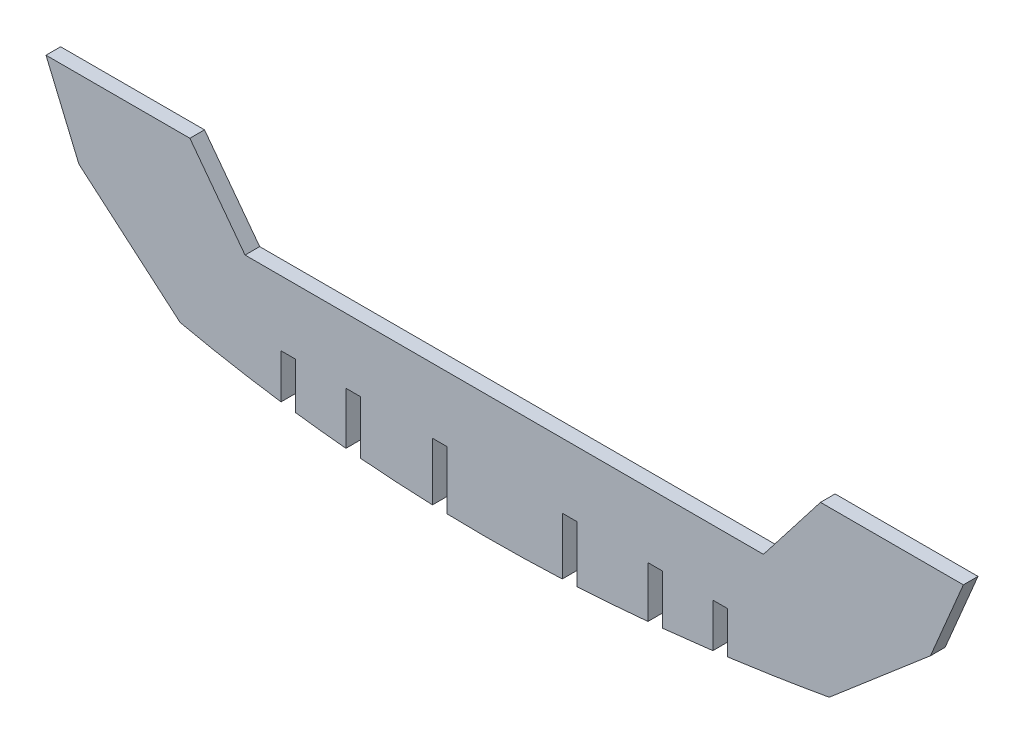
ISO-10303-21;
HEADER;
FILE_DESCRIPTION(('STEP AP214'),'2;1');
FILE_NAME('part.step','',(''),(''),'','','');
FILE_SCHEMA(('AUTOMOTIVE_DESIGN { 1 0 10303 214 1 1 1 1 }'));
ENDSEC;
DATA;
#1=APPLICATION_CONTEXT('core data for automotive mechanical design processes');
#2=APPLICATION_PROTOCOL_DEFINITION('international standard','automotive_design',2000,#1);
#3=PRODUCT_CONTEXT('',#1,'mechanical');
#4=PRODUCT('Part','Part','',(#3));
#5=PRODUCT_RELATED_PRODUCT_CATEGORY('part','',(#4));
#6=PRODUCT_DEFINITION_FORMATION('','',#4);
#7=PRODUCT_DEFINITION_CONTEXT('part definition',#1,'design');
#8=PRODUCT_DEFINITION('design','',#6,#7);
#9=PRODUCT_DEFINITION_SHAPE('','',#8);
#10=(LENGTH_UNIT() NAMED_UNIT(*) SI_UNIT(.MILLI.,.METRE.));
#11=(NAMED_UNIT(*) PLANE_ANGLE_UNIT() SI_UNIT($,.RADIAN.));
#12=(NAMED_UNIT(*) SI_UNIT($,.STERADIAN.) SOLID_ANGLE_UNIT());
#13=UNCERTAINTY_MEASURE_WITH_UNIT(LENGTH_MEASURE(1.E-05),#10,'distance_accuracy_value','');
#14=(GEOMETRIC_REPRESENTATION_CONTEXT(3) GLOBAL_UNCERTAINTY_ASSIGNED_CONTEXT((#13)) GLOBAL_UNIT_ASSIGNED_CONTEXT((#10,
#11,#12)) REPRESENTATION_CONTEXT('',''));
#15=CARTESIAN_POINT('',(0.,0.,0.));
#16=DIRECTION('',(0.,0.,1.));
#17=DIRECTION('',(1.,0.,0.));
#18=AXIS2_PLACEMENT_3D('',#15,#16,#17);
#19=CARTESIAN_POINT('',(-95.25,-19.05,4.2926));
#20=CARTESIAN_POINT('',(-66.0792350111344,-25.5146809383429,4.2926));
#21=CARTESIAN_POINT('',(-2.12159073980995,-32.083739423019,4.2926));
#22=CARTESIAN_POINT('',(61.7618618980102,-25.0102467709334,4.2926));
#23=CARTESIAN_POINT('',(95.25,-19.05,4.2926));
#24=B_SPLINE_CURVE_WITH_KNOTS('',3,(#19,#20,#21,#22,#23),.UNSPECIFIED.,.F.,.F.,(4,1,4),(0.,
0.46719867774018,1.),.UNSPECIFIED.);
#25=DIRECTION('',(0.,0.,-1.));
#26=VECTOR('',#25,1.);
#27=SURFACE_OF_LINEAR_EXTRUSION('',#24,#26);
#28=CARTESIAN_POINT('',(-42.3037,-27.0947511234712,4.2926));
#29=VERTEX_POINT('',#28);
#30=CARTESIAN_POINT('',(-21.1963,-28.3817433657437,4.2926));
#31=VERTEX_POINT('',#30);
#32=EDGE_CURVE('E934',#29,#31,#24,.T.);
#33=ORIENTED_EDGE('',*,*,#32,.F.);
#34=DIRECTION('',(0.,0.,-1.));
#35=VECTOR('',#34,1.);
#36=CARTESIAN_POINT('',(-42.3037,-27.0947511234712,4.2926));
#37=LINE('',#36,#35);
#38=CARTESIAN_POINT('',(-42.3037,-27.0947511234712,0.));
#39=VERTEX_POINT('',#38);
#40=EDGE_CURVE('E346',#29,#39,#37,.T.);
#41=ORIENTED_EDGE('',*,*,#40,.T.);
#42=CARTESIAN_POINT('',(-95.25,-19.05,0.));
#43=CARTESIAN_POINT('',(-66.0792350111344,-25.5146809383429,0.));
#44=CARTESIAN_POINT('',(-2.12159073980995,-32.083739423019,0.));
#45=CARTESIAN_POINT('',(61.7618618980102,-25.0102467709334,0.));
#46=CARTESIAN_POINT('',(95.25,-19.05,0.));
#47=B_SPLINE_CURVE_WITH_KNOTS('',3,(#42,#43,#44,#45,#46),.UNSPECIFIED.,.F.,.F.,(4,1,4),(0.,
0.46719867774018,1.),.UNSPECIFIED.);
#48=CARTESIAN_POINT('',(-21.1963,-28.3817433657437,0.));
#49=VERTEX_POINT('',#48);
#50=EDGE_CURVE('E428',#39,#49,#47,.T.);
#51=ORIENTED_EDGE('',*,*,#50,.T.);
#52=DIRECTION('',(0.,0.,-1.));
#53=VECTOR('',#52,1.);
#54=CARTESIAN_POINT('',(-21.1963,-28.3817433657437,4.2926));
#55=LINE('',#54,#53);
#56=EDGE_CURVE('E343',#49,#31,#55,.F.);
#57=ORIENTED_EDGE('',*,*,#56,.T.);
#58=EDGE_LOOP('',(#33,#41,#51,#57));
#59=FACE_BOUND('',#58,.T.);
#60=ADVANCED_FACE('F36',(#59),#27,.F.);
#61=CARTESIAN_POINT('',(-16.9037,-28.5176362998393,4.2926));
#62=VERTEX_POINT('',#61);
#63=CARTESIAN_POINT('',(16.9037,-28.1643569932418,4.2926));
#64=VERTEX_POINT('',#63);
#65=EDGE_CURVE('E341',#62,#64,#24,.T.);
#66=ORIENTED_EDGE('',*,*,#65,.F.);
#67=DIRECTION('',(0.,0.,-1.));
#68=VECTOR('',#67,1.);
#69=CARTESIAN_POINT('',(-16.9037,-28.5176362998393,4.2926));
#70=LINE('',#69,#68);
#71=CARTESIAN_POINT('',(-16.9037,-28.5176362998393,0.));
#72=VERTEX_POINT('',#71);
#73=EDGE_CURVE('E332',#62,#72,#70,.T.);
#74=ORIENTED_EDGE('',*,*,#73,.T.);
#75=CARTESIAN_POINT('',(16.9037,-28.1643569932418,0.));
#76=VERTEX_POINT('',#75);
#77=EDGE_CURVE('E328',#72,#76,#47,.T.);
#78=ORIENTED_EDGE('',*,*,#77,.T.);
#79=DIRECTION('',(0.,0.,-1.));
#80=VECTOR('',#79,1.);
#81=CARTESIAN_POINT('',(16.9037,-28.1643569932418,4.2926));
#82=LINE('',#81,#80);
#83=EDGE_CURVE('E527',#76,#64,#82,.F.);
#84=ORIENTED_EDGE('',*,*,#83,.T.);
#85=EDGE_LOOP('',(#66,#74,#78,#84));
#86=FACE_BOUND('',#85,.T.);
#87=ADVANCED_FACE('F338',(#86),#27,.F.);
#88=CARTESIAN_POINT('',(46.3388099629851,-25.969523057212,4.2926));
#89=VERTEX_POINT('',#88);
#90=CARTESIAN_POINT('',(61.0962099629851,-24.2813571350564,4.2926));
#91=VERTEX_POINT('',#90);
#92=EDGE_CURVE('E538',#89,#91,#24,.T.);
#93=ORIENTED_EDGE('',*,*,#92,.F.);
#94=DIRECTION('',(0.,0.,-1.));
#95=VECTOR('',#94,1.);
#96=CARTESIAN_POINT('',(46.3388099629852,-25.969523057212,4.2926));
#97=LINE('',#96,#95);
#98=CARTESIAN_POINT('',(46.3388099629851,-25.969523057212,0.));
#99=VERTEX_POINT('',#98);
#100=EDGE_CURVE('E349',#89,#99,#97,.T.);
#101=ORIENTED_EDGE('',*,*,#100,.T.);
#102=CARTESIAN_POINT('',(61.0962099629851,-24.2813571350564,0.));
#103=VERTEX_POINT('',#102);
#104=EDGE_CURVE('E416',#99,#103,#47,.T.);
#105=ORIENTED_EDGE('',*,*,#104,.T.);
#106=DIRECTION('',(0.,0.,-1.));
#107=VECTOR('',#106,1.);
#108=CARTESIAN_POINT('',(61.0962099629851,-24.2813571350564,4.2926));
#109=LINE('',#108,#107);
#110=EDGE_CURVE('E531',#103,#91,#109,.F.);
#111=ORIENTED_EDGE('',*,*,#110,.T.);
#112=EDGE_LOOP('',(#93,#101,#105,#111));
#113=FACE_BOUND('',#112,.T.);
#114=ADVANCED_FACE('F536',(#113),#27,.F.);
#115=CARTESIAN_POINT('',(65.3888099629851,-23.7221459042318,4.2926));
#116=VERTEX_POINT('',#115);
#117=CARTESIAN_POINT('',(95.25,-19.05,4.2926));
#118=VERTEX_POINT('',#117);
#119=EDGE_CURVE('E294',#116,#118,#24,.T.);
#120=ORIENTED_EDGE('',*,*,#119,.F.);
#121=DIRECTION('',(0.,0.,-1.));
#122=VECTOR('',#121,1.);
#123=CARTESIAN_POINT('',(65.3888099629851,-23.7221459042318,4.2926));
#124=LINE('',#123,#122);
#125=CARTESIAN_POINT('',(65.3888099629851,-23.7221459042318,0.));
#126=VERTEX_POINT('',#125);
#127=EDGE_CURVE('E415',#116,#126,#124,.T.);
#128=ORIENTED_EDGE('',*,*,#127,.T.);
#129=CARTESIAN_POINT('',(95.25,-19.05,0.));
#130=VERTEX_POINT('',#129);
#131=EDGE_CURVE('E362',#126,#130,#47,.T.);
#132=ORIENTED_EDGE('',*,*,#131,.T.);
#133=DIRECTION('',(0.,0.,-1.));
#134=VECTOR('',#133,1.);
#135=CARTESIAN_POINT('',(95.25,-19.05,4.2926));
#136=LINE('',#135,#134);
#137=EDGE_CURVE('E307',#118,#130,#136,.T.);
#138=ORIENTED_EDGE('',*,*,#137,.F.);
#139=EDGE_LOOP('',(#120,#128,#132,#138));
#140=FACE_BOUND('',#139,.T.);
#141=ADVANCED_FACE('F413',(#140),#27,.F.);
#142=CARTESIAN_POINT('',(21.1963,-27.9476728082947,0.));
#143=VERTEX_POINT('',#142);
#144=CARTESIAN_POINT('',(42.0462099629851,-26.3897699887696,0.));
#145=VERTEX_POINT('',#144);
#146=EDGE_CURVE('E418',#143,#145,#47,.T.);
#147=ORIENTED_EDGE('',*,*,#146,.T.);
#148=DIRECTION('',(0.,0.,-1.));
#149=VECTOR('',#148,1.);
#150=CARTESIAN_POINT('',(42.0462099629851,-26.3897699887696,4.2926));
#151=LINE('',#150,#149);
#152=CARTESIAN_POINT('',(42.0462099629851,-26.3897699887696,4.2926));
#153=VERTEX_POINT('',#152);
#154=EDGE_CURVE('E534',#145,#153,#151,.F.);
#155=ORIENTED_EDGE('',*,*,#154,.T.);
#156=CARTESIAN_POINT('',(21.1963,-27.9476728082947,4.2926));
#157=VERTEX_POINT('',#156);
#158=EDGE_CURVE('E554',#157,#153,#24,.T.);
#159=ORIENTED_EDGE('',*,*,#158,.F.);
#160=DIRECTION('',(0.,0.,-1.));
#161=VECTOR('',#160,1.);
#162=CARTESIAN_POINT('',(21.1963,-27.9476728082947,4.2926));
#163=LINE('',#162,#161);
#164=EDGE_CURVE('E529',#157,#143,#163,.T.);
#165=ORIENTED_EDGE('',*,*,#164,.T.);
#166=EDGE_LOOP('',(#147,#155,#159,#165));
#167=FACE_BOUND('',#166,.T.);
#168=ADVANCED_FACE('F584',(#167),#27,.F.);
#169=CARTESIAN_POINT('',(-61.3537,-25.0213087322138,0.));
#170=VERTEX_POINT('',#169);
#171=CARTESIAN_POINT('',(-46.5963,-26.7045433789957,0.));
#172=VERTEX_POINT('',#171);
#173=EDGE_CURVE('E392',#170,#172,#47,.T.);
#174=ORIENTED_EDGE('',*,*,#173,.T.);
#175=DIRECTION('',(0.,0.,-1.));
#176=VECTOR('',#175,1.);
#177=CARTESIAN_POINT('',(-46.5963,-26.7045433789957,4.2926));
#178=LINE('',#177,#176);
#179=CARTESIAN_POINT('',(-46.5963,-26.7045433789957,4.2926));
#180=VERTEX_POINT('',#179);
#181=EDGE_CURVE('E342',#172,#180,#178,.F.);
#182=ORIENTED_EDGE('',*,*,#181,.T.);
#183=CARTESIAN_POINT('',(-61.3537,-25.0213087322138,4.2926));
#184=VERTEX_POINT('',#183);
#185=EDGE_CURVE('E370',#184,#180,#24,.T.);
#186=ORIENTED_EDGE('',*,*,#185,.F.);
#187=DIRECTION('',(0.,0.,-1.));
#188=VECTOR('',#187,1.);
#189=CARTESIAN_POINT('',(-61.3537,-25.0213087322138,4.2926));
#190=LINE('',#189,#188);
#191=EDGE_CURVE('E438',#184,#170,#190,.T.);
#192=ORIENTED_EDGE('',*,*,#191,.T.);
#193=EDGE_LOOP('',(#174,#182,#186,#192));
#194=FACE_BOUND('',#193,.T.);
#195=ADVANCED_FACE('F435',(#194),#27,.F.);
#196=CARTESIAN_POINT('',(-95.25,-19.05,0.));
#197=VERTEX_POINT('',#196);
#198=CARTESIAN_POINT('',(-65.6463,-24.4302717503621,0.));
#199=VERTEX_POINT('',#198);
#200=EDGE_CURVE('E386',#197,#199,#47,.T.);
#201=ORIENTED_EDGE('',*,*,#200,.T.);
#202=DIRECTION('',(0.,0.,-1.));
#203=VECTOR('',#202,1.);
#204=CARTESIAN_POINT('',(-65.6463,-24.4302717503621,4.2926));
#205=LINE('',#204,#203);
#206=CARTESIAN_POINT('',(-65.6463,-24.4302717503621,4.2926));
#207=VERTEX_POINT('',#206);
#208=EDGE_CURVE('E521',#199,#207,#205,.F.);
#209=ORIENTED_EDGE('',*,*,#208,.T.);
#210=CARTESIAN_POINT('',(-95.25,-19.05,4.2926));
#211=VERTEX_POINT('',#210);
#212=EDGE_CURVE('E363',#211,#207,#24,.T.);
#213=ORIENTED_EDGE('',*,*,#212,.F.);
#214=DIRECTION('',(0.,0.,-1.));
#215=VECTOR('',#214,1.);
#216=CARTESIAN_POINT('',(-95.25,-19.05,4.2926));
#217=LINE('',#216,#215);
#218=EDGE_CURVE('E295',#211,#197,#217,.T.);
#219=ORIENTED_EDGE('',*,*,#218,.T.);
#220=EDGE_LOOP('',(#201,#209,#213,#219));
#221=FACE_BOUND('',#220,.T.);
#222=ADVANCED_FACE('F38',(#221),#27,.F.);
#223=CARTESIAN_POINT('',(49.6173329393389,-58.0522795390266,4.2926));
#224=DIRECTION('',(0.649720599003113,-0.760173100833643,0.));
#225=DIRECTION('',(0.760173100833643,0.649720599003113,0.));
#226=AXIS2_PLACEMENT_3D('',#223,#224,#225);
#227=PLANE('',#226);
#228=DIRECTION('',(-0.760173100833643,-0.649720599003113,0.));
#229=VECTOR('',#228,1.);
#230=CARTESIAN_POINT('',(49.6173329393389,-58.0522795390266,0.));
#231=LINE('',#230,#229);
#232=CARTESIAN_POINT('',(124.968,6.35,0.));
#233=VERTEX_POINT('',#232);
#234=EDGE_CURVE('E391',#233,#130,#231,.T.);
#235=ORIENTED_EDGE('',*,*,#234,.F.);
#236=DIRECTION('',(0.,0.,-1.));
#237=VECTOR('',#236,1.);
#238=CARTESIAN_POINT('',(124.968,6.35,4.2926));
#239=LINE('',#238,#237);
#240=CARTESIAN_POINT('',(124.968,6.35,4.2926));
#241=VERTEX_POINT('',#240);
#242=EDGE_CURVE('E305',#241,#233,#239,.T.);
#243=ORIENTED_EDGE('',*,*,#242,.F.);
#244=DIRECTION('',(-0.760173100833643,-0.649720599003113,0.));
#245=VECTOR('',#244,1.);
#246=CARTESIAN_POINT('',(49.6173329393389,-58.0522795390266,4.2926));
#247=LINE('',#246,#245);
#248=EDGE_CURVE('E369',#241,#118,#247,.T.);
#249=ORIENTED_EDGE('',*,*,#248,.T.);
#250=ORIENTED_EDGE('',*,*,#137,.T.);
#251=EDGE_LOOP('',(#235,#243,#249,#250));
#252=FACE_BOUND('',#251,.T.);
#253=ADVANCED_FACE('F409',(#252),#227,.T.);
#254=CARTESIAN_POINT('',(103.784974853311,-43.8203227158424,4.2926));
#255=DIRECTION('',(0.921249561411386,-0.388972037040363,0.));
#256=DIRECTION('',(0.388972037040363,0.921249561411386,0.));
#257=AXIS2_PLACEMENT_3D('',#254,#255,#256);
#258=PLANE('',#257);
#259=DIRECTION('',(-0.388972037040363,-0.921249561411386,0.));
#260=VECTOR('',#259,1.);
#261=CARTESIAN_POINT('',(103.784974853311,-43.8203227158424,0.));
#262=LINE('',#261,#260);
#263=CARTESIAN_POINT('',(134.62,29.21,0.));
#264=VERTEX_POINT('',#263);
#265=EDGE_CURVE('E289',#264,#233,#262,.T.);
#266=ORIENTED_EDGE('',*,*,#265,.F.);
#267=DIRECTION('',(0.,0.,-1.));
#268=VECTOR('',#267,1.);
#269=CARTESIAN_POINT('',(134.62,29.21,4.2926));
#270=LINE('',#269,#268);
#271=CARTESIAN_POINT('',(134.62,29.21,4.2926));
#272=VERTEX_POINT('',#271);
#273=EDGE_CURVE('E302',#272,#264,#270,.T.);
#274=ORIENTED_EDGE('',*,*,#273,.F.);
#275=DIRECTION('',(-0.388972037040363,-0.921249561411386,0.));
#276=VECTOR('',#275,1.);
#277=CARTESIAN_POINT('',(103.784974853311,-43.8203227158424,4.2926));
#278=LINE('',#277,#276);
#279=EDGE_CURVE('E376',#272,#241,#278,.T.);
#280=ORIENTED_EDGE('',*,*,#279,.T.);
#281=ORIENTED_EDGE('',*,*,#242,.T.);
#282=EDGE_LOOP('',(#266,#274,#280,#281));
#283=FACE_BOUND('',#282,.T.);
#284=ADVANCED_FACE('F405',(#283),#258,.T.);
#285=CARTESIAN_POINT('',(0.,29.21,4.2926));
#286=DIRECTION('',(0.,1.,0.));
#287=DIRECTION('',(0.,0.,1.));
#288=AXIS2_PLACEMENT_3D('',#285,#286,#287);
#289=PLANE('',#288);
#290=DIRECTION('',(0.,0.,1.));
#291=VECTOR('',#290,1.);
#292=CARTESIAN_POINT('',(92.6821762916418,29.21,0.));
#293=LINE('',#292,#291);
#294=CARTESIAN_POINT('',(92.6821762916418,29.21,0.));
#295=VERTEX_POINT('',#294);
#296=CARTESIAN_POINT('',(92.6821762916418,29.21,4.2926));
#297=VERTEX_POINT('',#296);
#298=EDGE_CURVE('E611',#295,#297,#293,.T.);
#299=ORIENTED_EDGE('',*,*,#298,.T.);
#300=DIRECTION('',(1.,0.,0.));
#301=VECTOR('',#300,1.);
#302=CARTESIAN_POINT('',(0.,29.21,4.2926));
#303=LINE('',#302,#301);
#304=EDGE_CURVE('E379',#297,#272,#303,.T.);
#305=ORIENTED_EDGE('',*,*,#304,.T.);
#306=ORIENTED_EDGE('',*,*,#273,.T.);
#307=DIRECTION('',(1.,0.,0.));
#308=VECTOR('',#307,1.);
#309=CARTESIAN_POINT('',(0.,29.21,0.));
#310=LINE('',#309,#308);
#311=EDGE_CURVE('E285',#295,#264,#310,.T.);
#312=ORIENTED_EDGE('',*,*,#311,.F.);
#313=EDGE_LOOP('',(#299,#305,#306,#312));
#314=FACE_BOUND('',#313,.T.);
#315=ADVANCED_FACE('F623',(#314),#289,.T.);
#316=CARTESIAN_POINT('',(0.,29.21,4.2926));
#317=DIRECTION('',(0.,-1.,0.));
#318=DIRECTION('',(1.,0.,0.));
#319=AXIS2_PLACEMENT_3D('',#316,#317,#318);
#320=PLANE('',#319);
#321=DIRECTION('',(-1.,0.,0.));
#322=VECTOR('',#321,1.);
#323=CARTESIAN_POINT('',(0.,29.21,4.2926));
#324=LINE('',#323,#322);
#325=CARTESIAN_POINT('',(-92.3925,29.21,4.2926));
#326=VERTEX_POINT('',#325);
#327=CARTESIAN_POINT('',(-134.62,29.21,4.2926));
#328=VERTEX_POINT('',#327);
#329=EDGE_CURVE('E276',#326,#328,#324,.T.);
#330=ORIENTED_EDGE('',*,*,#329,.F.);
#331=DIRECTION('',(0.,0.,1.));
#332=VECTOR('',#331,1.);
#333=CARTESIAN_POINT('',(-92.3925,29.21,0.));
#334=LINE('',#333,#332);
#335=CARTESIAN_POINT('',(-92.3925,29.21,0.));
#336=VERTEX_POINT('',#335);
#337=EDGE_CURVE('E260',#336,#326,#334,.T.);
#338=ORIENTED_EDGE('',*,*,#337,.F.);
#339=DIRECTION('',(-1.,0.,0.));
#340=VECTOR('',#339,1.);
#341=CARTESIAN_POINT('',(0.,29.21,0.));
#342=LINE('',#341,#340);
#343=CARTESIAN_POINT('',(-134.62,29.21,0.));
#344=VERTEX_POINT('',#343);
#345=EDGE_CURVE('E274',#336,#344,#342,.T.);
#346=ORIENTED_EDGE('',*,*,#345,.T.);
#347=DIRECTION('',(0.,0.,-1.));
#348=VECTOR('',#347,1.);
#349=CARTESIAN_POINT('',(-134.62,29.21,4.2926));
#350=LINE('',#349,#348);
#351=EDGE_CURVE('E300',#328,#344,#350,.T.);
#352=ORIENTED_EDGE('',*,*,#351,.F.);
#353=EDGE_LOOP('',(#330,#338,#346,#352));
#354=FACE_BOUND('',#353,.T.);
#355=ADVANCED_FACE('F272',(#354),#320,.F.);
#356=CARTESIAN_POINT('',(-103.784974853311,-43.8203227158424,4.2926));
#357=DIRECTION('',(0.921249561411386,0.388972037040363,0.));
#358=DIRECTION('',(-0.388972037040363,0.921249561411386,0.));
#359=AXIS2_PLACEMENT_3D('',#356,#357,#358);
#360=PLANE('',#359);
#361=DIRECTION('',(0.388972037040363,-0.921249561411386,0.));
#362=VECTOR('',#361,1.);
#363=CARTESIAN_POINT('',(-103.784974853311,-43.8203227158424,0.));
#364=LINE('',#363,#362);
#365=CARTESIAN_POINT('',(-124.968,6.35,0.));
#366=VERTEX_POINT('',#365);
#367=EDGE_CURVE('E284',#344,#366,#364,.T.);
#368=ORIENTED_EDGE('',*,*,#367,.T.);
#369=DIRECTION('',(0.,0.,-1.));
#370=VECTOR('',#369,1.);
#371=CARTESIAN_POINT('',(-124.968,6.35,4.2926));
#372=LINE('',#371,#370);
#373=CARTESIAN_POINT('',(-124.968,6.35,4.2926));
#374=VERTEX_POINT('',#373);
#375=EDGE_CURVE('E297',#374,#366,#372,.T.);
#376=ORIENTED_EDGE('',*,*,#375,.F.);
#377=DIRECTION('',(0.388972037040363,-0.921249561411386,0.));
#378=VECTOR('',#377,1.);
#379=CARTESIAN_POINT('',(-103.784974853311,-43.8203227158424,4.2926));
#380=LINE('',#379,#378);
#381=EDGE_CURVE('E382',#328,#374,#380,.T.);
#382=ORIENTED_EDGE('',*,*,#381,.F.);
#383=ORIENTED_EDGE('',*,*,#351,.T.);
#384=EDGE_LOOP('',(#368,#376,#382,#383));
#385=FACE_BOUND('',#384,.T.);
#386=ADVANCED_FACE('F594',(#385),#360,.F.);
#387=CARTESIAN_POINT('',(-49.6173329393389,-58.0522795390266,4.2926));
#388=DIRECTION('',(-0.649720599003113,-0.760173100833643,0.));
#389=DIRECTION('',(0.760173100833643,-0.649720599003113,0.));
#390=AXIS2_PLACEMENT_3D('',#387,#388,#389);
#391=PLANE('',#390);
#392=DIRECTION('',(-0.760173100833643,0.649720599003113,0.));
#393=VECTOR('',#392,1.);
#394=CARTESIAN_POINT('',(-49.6173329393389,-58.0522795390266,0.));
#395=LINE('',#394,#393);
#396=EDGE_CURVE('E287',#197,#366,#395,.T.);
#397=ORIENTED_EDGE('',*,*,#396,.F.);
#398=ORIENTED_EDGE('',*,*,#218,.F.);
#399=DIRECTION('',(-0.760173100833643,0.649720599003113,0.));
#400=VECTOR('',#399,1.);
#401=CARTESIAN_POINT('',(-49.6173329393389,-58.0522795390266,4.2926));
#402=LINE('',#401,#400);
#403=EDGE_CURVE('E298',#211,#374,#402,.T.);
#404=ORIENTED_EDGE('',*,*,#403,.T.);
#405=ORIENTED_EDGE('',*,*,#375,.T.);
#406=EDGE_LOOP('',(#397,#398,#404,#405));
#407=FACE_BOUND('',#406,.T.);
#408=ADVANCED_FACE('F589',(#407),#391,.T.);
#409=CARTESIAN_POINT('',(0.,0.,4.2926));
#410=DIRECTION('',(0.,0.,1.));
#411=DIRECTION('',(1.,0.,0.));
#412=AXIS2_PLACEMENT_3D('',#409,#410,#411);
#413=PLANE('',#412);
#414=DIRECTION('',(0.,1.,0.));
#415=VECTOR('',#414,1.);
#416=CARTESIAN_POINT('',(-42.3037,-31.75,4.2926));
#417=LINE('',#416,#415);
#418=CARTESIAN_POINT('',(-42.3037,-11.43,4.2926));
#419=VERTEX_POINT('',#418);
#420=EDGE_CURVE('E452',#29,#419,#417,.T.);
#421=ORIENTED_EDGE('',*,*,#420,.F.);
#422=ORIENTED_EDGE('',*,*,#32,.T.);
#423=DIRECTION('',(0.,-1.,0.));
#424=VECTOR('',#423,1.);
#425=CARTESIAN_POINT('',(-21.1963,-11.43,4.2926));
#426=LINE('',#425,#424);
#427=CARTESIAN_POINT('',(-21.1963,-11.43,4.2926));
#428=VERTEX_POINT('',#427);
#429=EDGE_CURVE('E462',#428,#31,#426,.T.);
#430=ORIENTED_EDGE('',*,*,#429,.F.);
#431=DIRECTION('',(-1.,0.,0.));
#432=VECTOR('',#431,1.);
#433=CARTESIAN_POINT('',(-21.1963,-11.43,4.2926));
#434=LINE('',#433,#432);
#435=CARTESIAN_POINT('',(-16.9037,-11.43,4.2926));
#436=VERTEX_POINT('',#435);
#437=EDGE_CURVE('E466',#436,#428,#434,.T.);
#438=ORIENTED_EDGE('',*,*,#437,.F.);
#439=DIRECTION('',(0.,1.,0.));
#440=VECTOR('',#439,1.);
#441=CARTESIAN_POINT('',(-16.9037,-11.43,4.2926));
#442=LINE('',#441,#440);
#443=EDGE_CURVE('E464',#62,#436,#442,.T.);
#444=ORIENTED_EDGE('',*,*,#443,.F.);
#445=ORIENTED_EDGE('',*,*,#65,.T.);
#446=DIRECTION('',(0.,-1.,0.));
#447=VECTOR('',#446,1.);
#448=CARTESIAN_POINT('',(16.9037,-11.43,4.2926));
#449=LINE('',#448,#447);
#450=CARTESIAN_POINT('',(16.9037,-11.43,4.2926));
#451=VERTEX_POINT('',#450);
#452=EDGE_CURVE('E606',#451,#64,#449,.T.);
#453=ORIENTED_EDGE('',*,*,#452,.F.);
#454=DIRECTION('',(-1.,0.,0.));
#455=VECTOR('',#454,1.);
#456=CARTESIAN_POINT('',(16.9037,-11.43,4.2926));
#457=LINE('',#456,#455);
#458=CARTESIAN_POINT('',(21.1963,-11.43,4.2926));
#459=VERTEX_POINT('',#458);
#460=EDGE_CURVE('E610',#459,#451,#457,.T.);
#461=ORIENTED_EDGE('',*,*,#460,.F.);
#462=DIRECTION('',(0.,1.,0.));
#463=VECTOR('',#462,1.);
#464=CARTESIAN_POINT('',(21.1963,-11.43,4.2926));
#465=LINE('',#464,#463);
#466=EDGE_CURVE('E608',#157,#459,#465,.T.);
#467=ORIENTED_EDGE('',*,*,#466,.F.);
#468=ORIENTED_EDGE('',*,*,#158,.T.);
#469=DIRECTION('',(0.,-1.,0.));
#470=VECTOR('',#469,1.);
#471=CARTESIAN_POINT('',(42.0462099629851,-11.43,4.2926));
#472=LINE('',#471,#470);
#473=CARTESIAN_POINT('',(42.0462099629851,-11.43,4.2926));
#474=VERTEX_POINT('',#473);
#475=EDGE_CURVE('E477',#474,#153,#472,.T.);
#476=ORIENTED_EDGE('',*,*,#475,.F.);
#477=DIRECTION('',(-1.,0.,0.));
#478=VECTOR('',#477,1.);
#479=CARTESIAN_POINT('',(42.0462099629851,-11.43,4.2926));
#480=LINE('',#479,#478);
#481=CARTESIAN_POINT('',(46.3388099629851,-11.43,4.2926));
#482=VERTEX_POINT('',#481);
#483=EDGE_CURVE('E483',#482,#474,#480,.T.);
#484=ORIENTED_EDGE('',*,*,#483,.F.);
#485=DIRECTION('',(0.,1.,0.));
#486=VECTOR('',#485,1.);
#487=CARTESIAN_POINT('',(46.3388099629851,-11.43,4.2926));
#488=LINE('',#487,#486);
#489=EDGE_CURVE('E481',#89,#482,#488,.T.);
#490=ORIENTED_EDGE('',*,*,#489,.F.);
#491=ORIENTED_EDGE('',*,*,#92,.T.);
#492=DIRECTION('',(0.,-1.,0.));
#493=VECTOR('',#492,1.);
#494=CARTESIAN_POINT('',(61.0962099629851,-11.43,4.2926));
#495=LINE('',#494,#493);
#496=CARTESIAN_POINT('',(61.0962099629851,-11.43,4.2926));
#497=VERTEX_POINT('',#496);
#498=EDGE_CURVE('E495',#497,#91,#495,.T.);
#499=ORIENTED_EDGE('',*,*,#498,.F.);
#500=DIRECTION('',(-1.,0.,0.));
#501=VECTOR('',#500,1.);
#502=CARTESIAN_POINT('',(61.0962099629851,-11.43,4.2926));
#503=LINE('',#502,#501);
#504=CARTESIAN_POINT('',(65.3888099629851,-11.43,4.2926));
#505=VERTEX_POINT('',#504);
#506=EDGE_CURVE('E500',#505,#497,#503,.T.);
#507=ORIENTED_EDGE('',*,*,#506,.F.);
#508=DIRECTION('',(0.,1.,0.));
#509=VECTOR('',#508,1.);
#510=CARTESIAN_POINT('',(65.3888099629851,-11.43,4.2926));
#511=LINE('',#510,#509);
#512=EDGE_CURVE('E277',#116,#505,#511,.T.);
#513=ORIENTED_EDGE('',*,*,#512,.F.);
#514=ORIENTED_EDGE('',*,*,#119,.T.);
#515=ORIENTED_EDGE('',*,*,#248,.F.);
#516=ORIENTED_EDGE('',*,*,#279,.F.);
#517=ORIENTED_EDGE('',*,*,#304,.F.);
#518=DIRECTION('',(0.612741252836286,0.790283592815021,0.));
#519=VECTOR('',#518,1.);
#520=CARTESIAN_POINT('',(75.9425099629851,7.62000000000001,4.2926));
#521=LINE('',#520,#519);
#522=CARTESIAN_POINT('',(75.9425099629851,7.62000000000001,4.2926));
#523=VERTEX_POINT('',#522);
#524=EDGE_CURVE('E619',#523,#297,#521,.T.);
#525=ORIENTED_EDGE('',*,*,#524,.F.);
#526=DIRECTION('',(1.,0.,0.));
#527=VECTOR('',#526,1.);
#528=CARTESIAN_POINT('',(-76.2,7.62000000000001,4.2926));
#529=LINE('',#528,#527);
#530=CARTESIAN_POINT('',(-76.2,7.62000000000001,4.2926));
#531=VERTEX_POINT('',#530);
#532=EDGE_CURVE('E355',#531,#523,#529,.T.);
#533=ORIENTED_EDGE('',*,*,#532,.F.);
#534=DIRECTION('',(0.600000000000001,-0.799999999999999,0.));
#535=VECTOR('',#534,1.);
#536=CARTESIAN_POINT('',(-92.3925,29.21,4.2926));
#537=LINE('',#536,#535);
#538=EDGE_CURVE('E268',#326,#531,#537,.T.);
#539=ORIENTED_EDGE('',*,*,#538,.F.);
#540=ORIENTED_EDGE('',*,*,#329,.T.);
#541=ORIENTED_EDGE('',*,*,#381,.T.);
#542=ORIENTED_EDGE('',*,*,#403,.F.);
#543=ORIENTED_EDGE('',*,*,#212,.T.);
#544=DIRECTION('',(0.,-1.,0.));
#545=VECTOR('',#544,1.);
#546=CARTESIAN_POINT('',(-65.6463,-31.75,4.2926));
#547=LINE('',#546,#545);
#548=CARTESIAN_POINT('',(-65.6463,-11.43,4.2926));
#549=VERTEX_POINT('',#548);
#550=EDGE_CURVE('E510',#549,#207,#547,.T.);
#551=ORIENTED_EDGE('',*,*,#550,.F.);
#552=DIRECTION('',(-1.,0.,0.));
#553=VECTOR('',#552,1.);
#554=CARTESIAN_POINT('',(-65.6463,-11.43,4.2926));
#555=LINE('',#554,#553);
#556=CARTESIAN_POINT('',(-61.3537,-11.43,4.2926));
#557=VERTEX_POINT('',#556);
#558=EDGE_CURVE('E515',#557,#549,#555,.T.);
#559=ORIENTED_EDGE('',*,*,#558,.F.);
#560=DIRECTION('',(0.,1.,0.));
#561=VECTOR('',#560,1.);
#562=CARTESIAN_POINT('',(-61.3537,-31.75,4.2926));
#563=LINE('',#562,#561);
#564=EDGE_CURVE('E459',#184,#557,#563,.T.);
#565=ORIENTED_EDGE('',*,*,#564,.F.);
#566=ORIENTED_EDGE('',*,*,#185,.T.);
#567=DIRECTION('',(0.,-1.,0.));
#568=VECTOR('',#567,1.);
#569=CARTESIAN_POINT('',(-46.5963,-31.75,4.2926));
#570=LINE('',#569,#568);
#571=CARTESIAN_POINT('',(-46.5963,-11.43,4.2926));
#572=VERTEX_POINT('',#571);
#573=EDGE_CURVE('E448',#572,#180,#570,.T.);
#574=ORIENTED_EDGE('',*,*,#573,.F.);
#575=DIRECTION('',(-1.,0.,0.));
#576=VECTOR('',#575,1.);
#577=CARTESIAN_POINT('',(-46.5963,-11.43,4.2926));
#578=LINE('',#577,#576);
#579=EDGE_CURVE('E454',#419,#572,#578,.T.);
#580=ORIENTED_EDGE('',*,*,#579,.F.);
#581=EDGE_LOOP('',(#421,#422,#430,#438,#444,#445,#453,#461,#467,#468,#476,#484,#490,#491,#499,
#507,#513,#514,#515,#516,#517,#525,#533,#539,#540,#541,#542,#543,#551,#559,#565,#566,#574,#580));
#582=FACE_BOUND('',#581,.T.);
#583=ADVANCED_FACE('F552',(#582),#413,.T.);
#584=CARTESIAN_POINT('',(0.,0.,0.));
#585=DIRECTION('',(0.,0.,1.));
#586=DIRECTION('',(1.,0.,0.));
#587=AXIS2_PLACEMENT_3D('',#584,#585,#586);
#588=PLANE('',#587);
#589=ORIENTED_EDGE('',*,*,#50,.F.);
#590=DIRECTION('',(0.,1.,0.));
#591=VECTOR('',#590,1.);
#592=CARTESIAN_POINT('',(-42.3037,0.,0.));
#593=LINE('',#592,#591);
#594=CARTESIAN_POINT('',(-42.3037,-11.43,0.));
#595=VERTEX_POINT('',#594);
#596=EDGE_CURVE('E11',#39,#595,#593,.T.);
#597=ORIENTED_EDGE('',*,*,#596,.T.);
#598=DIRECTION('',(-1.,0.,0.));
#599=VECTOR('',#598,1.);
#600=CARTESIAN_POINT('',(-46.5963,-11.43,0.));
#601=LINE('',#600,#599);
#602=CARTESIAN_POINT('',(-46.5963,-11.43,0.));
#603=VERTEX_POINT('',#602);
#604=EDGE_CURVE('E442',#595,#603,#601,.T.);
#605=ORIENTED_EDGE('',*,*,#604,.T.);
#606=DIRECTION('',(0.,-1.,0.));
#607=VECTOR('',#606,1.);
#608=CARTESIAN_POINT('',(-46.5963,-31.75,0.));
#609=LINE('',#608,#607);
#610=EDGE_CURVE('E52',#603,#172,#609,.T.);
#611=ORIENTED_EDGE('',*,*,#610,.T.);
#612=ORIENTED_EDGE('',*,*,#173,.F.);
#613=DIRECTION('',(0.,1.,0.));
#614=VECTOR('',#613,1.);
#615=CARTESIAN_POINT('',(-61.3537,0.,0.));
#616=LINE('',#615,#614);
#617=CARTESIAN_POINT('',(-61.3537,-11.43,0.));
#618=VERTEX_POINT('',#617);
#619=EDGE_CURVE('E310',#170,#618,#616,.T.);
#620=ORIENTED_EDGE('',*,*,#619,.T.);
#621=DIRECTION('',(-1.,0.,0.));
#622=VECTOR('',#621,1.);
#623=CARTESIAN_POINT('',(-65.6463,-11.43,0.));
#624=LINE('',#623,#622);
#625=CARTESIAN_POINT('',(-65.6463,-11.43,0.));
#626=VERTEX_POINT('',#625);
#627=EDGE_CURVE('E507',#618,#626,#624,.T.);
#628=ORIENTED_EDGE('',*,*,#627,.T.);
#629=DIRECTION('',(0.,-1.,0.));
#630=VECTOR('',#629,1.);
#631=CARTESIAN_POINT('',(-65.6463,-31.75,0.));
#632=LINE('',#631,#630);
#633=EDGE_CURVE('E509',#626,#199,#632,.T.);
#634=ORIENTED_EDGE('',*,*,#633,.T.);
#635=ORIENTED_EDGE('',*,*,#200,.F.);
#636=ORIENTED_EDGE('',*,*,#396,.T.);
#637=ORIENTED_EDGE('',*,*,#367,.F.);
#638=ORIENTED_EDGE('',*,*,#345,.F.);
#639=DIRECTION('',(0.600000000000001,-0.799999999999999,0.));
#640=VECTOR('',#639,1.);
#641=CARTESIAN_POINT('',(-92.3925,29.21,0.));
#642=LINE('',#641,#640);
#643=CARTESIAN_POINT('',(-76.2,7.62000000000001,0.));
#644=VERTEX_POINT('',#643);
#645=EDGE_CURVE('E257',#336,#644,#642,.T.);
#646=ORIENTED_EDGE('',*,*,#645,.T.);
#647=DIRECTION('',(1.,0.,0.));
#648=VECTOR('',#647,1.);
#649=CARTESIAN_POINT('',(-76.2,7.62000000000001,0.));
#650=LINE('',#649,#648);
#651=CARTESIAN_POINT('',(75.9425099629851,7.62000000000001,0.));
#652=VERTEX_POINT('',#651);
#653=EDGE_CURVE('E356',#644,#652,#650,.T.);
#654=ORIENTED_EDGE('',*,*,#653,.T.);
#655=DIRECTION('',(0.612741252836286,0.790283592815021,0.));
#656=VECTOR('',#655,1.);
#657=CARTESIAN_POINT('',(75.9425099629851,7.62000000000001,0.));
#658=LINE('',#657,#656);
#659=EDGE_CURVE('E617',#652,#295,#658,.T.);
#660=ORIENTED_EDGE('',*,*,#659,.T.);
#661=ORIENTED_EDGE('',*,*,#311,.T.);
#662=ORIENTED_EDGE('',*,*,#265,.T.);
#663=ORIENTED_EDGE('',*,*,#234,.T.);
#664=ORIENTED_EDGE('',*,*,#131,.F.);
#665=DIRECTION('',(0.,1.,0.));
#666=VECTOR('',#665,1.);
#667=CARTESIAN_POINT('',(65.3888099629851,0.,0.));
#668=LINE('',#667,#666);
#669=CARTESIAN_POINT('',(65.3888099629851,-11.43,0.));
#670=VERTEX_POINT('',#669);
#671=EDGE_CURVE('E316',#126,#670,#668,.T.);
#672=ORIENTED_EDGE('',*,*,#671,.T.);
#673=DIRECTION('',(-1.,0.,0.));
#674=VECTOR('',#673,1.);
#675=CARTESIAN_POINT('',(61.0962099629851,-11.43,0.));
#676=LINE('',#675,#674);
#677=CARTESIAN_POINT('',(61.0962099629851,-11.43,0.));
#678=VERTEX_POINT('',#677);
#679=EDGE_CURVE('E491',#670,#678,#676,.T.);
#680=ORIENTED_EDGE('',*,*,#679,.T.);
#681=DIRECTION('',(0.,-1.,0.));
#682=VECTOR('',#681,1.);
#683=CARTESIAN_POINT('',(61.0962099629851,-11.43,0.));
#684=LINE('',#683,#682);
#685=EDGE_CURVE('E494',#678,#103,#684,.T.);
#686=ORIENTED_EDGE('',*,*,#685,.T.);
#687=ORIENTED_EDGE('',*,*,#104,.F.);
#688=DIRECTION('',(0.,1.,0.));
#689=VECTOR('',#688,1.);
#690=CARTESIAN_POINT('',(46.3388099629851,0.,0.));
#691=LINE('',#690,#689);
#692=CARTESIAN_POINT('',(46.3388099629851,-11.43,0.));
#693=VERTEX_POINT('',#692);
#694=EDGE_CURVE('E319',#99,#693,#691,.T.);
#695=ORIENTED_EDGE('',*,*,#694,.T.);
#696=DIRECTION('',(-1.,0.,0.));
#697=VECTOR('',#696,1.);
#698=CARTESIAN_POINT('',(42.0462099629851,-11.43,0.));
#699=LINE('',#698,#697);
#700=CARTESIAN_POINT('',(42.0462099629851,-11.43,0.));
#701=VERTEX_POINT('',#700);
#702=EDGE_CURVE('E473',#693,#701,#699,.T.);
#703=ORIENTED_EDGE('',*,*,#702,.T.);
#704=DIRECTION('',(0.,-1.,0.));
#705=VECTOR('',#704,1.);
#706=CARTESIAN_POINT('',(42.0462099629851,-11.43,0.));
#707=LINE('',#706,#705);
#708=EDGE_CURVE('E476',#701,#145,#707,.T.);
#709=ORIENTED_EDGE('',*,*,#708,.T.);
#710=ORIENTED_EDGE('',*,*,#146,.F.);
#711=DIRECTION('',(0.,1.,0.));
#712=VECTOR('',#711,1.);
#713=CARTESIAN_POINT('',(21.1963,0.,0.));
#714=LINE('',#713,#712);
#715=CARTESIAN_POINT('',(21.1963,-11.43,0.));
#716=VERTEX_POINT('',#715);
#717=EDGE_CURVE('E313',#143,#716,#714,.T.);
#718=ORIENTED_EDGE('',*,*,#717,.T.);
#719=DIRECTION('',(-1.,0.,0.));
#720=VECTOR('',#719,1.);
#721=CARTESIAN_POINT('',(16.9037,-11.43,0.));
#722=LINE('',#721,#720);
#723=CARTESIAN_POINT('',(16.9037,-11.43,0.));
#724=VERTEX_POINT('',#723);
#725=EDGE_CURVE('E602',#716,#724,#722,.T.);
#726=ORIENTED_EDGE('',*,*,#725,.T.);
#727=DIRECTION('',(0.,-1.,0.));
#728=VECTOR('',#727,1.);
#729=CARTESIAN_POINT('',(16.9037,-11.43,0.));
#730=LINE('',#729,#728);
#731=EDGE_CURVE('E605',#724,#76,#730,.T.);
#732=ORIENTED_EDGE('',*,*,#731,.T.);
#733=ORIENTED_EDGE('',*,*,#77,.F.);
#734=DIRECTION('',(0.,1.,0.));
#735=VECTOR('',#734,1.);
#736=CARTESIAN_POINT('',(-16.9037,0.,0.));
#737=LINE('',#736,#735);
#738=CARTESIAN_POINT('',(-16.9037,-11.43,0.));
#739=VERTEX_POINT('',#738);
#740=EDGE_CURVE('E45',#72,#739,#737,.T.);
#741=ORIENTED_EDGE('',*,*,#740,.T.);
#742=DIRECTION('',(-1.,0.,0.));
#743=VECTOR('',#742,1.);
#744=CARTESIAN_POINT('',(-21.1963,-11.43,0.));
#745=LINE('',#744,#743);
#746=CARTESIAN_POINT('',(-21.1963,-11.43,0.));
#747=VERTEX_POINT('',#746);
#748=EDGE_CURVE('E325',#739,#747,#745,.T.);
#749=ORIENTED_EDGE('',*,*,#748,.T.);
#750=DIRECTION('',(0.,-1.,0.));
#751=VECTOR('',#750,1.);
#752=CARTESIAN_POINT('',(-21.1963,-11.43,0.));
#753=LINE('',#752,#751);
#754=EDGE_CURVE('E60',#747,#49,#753,.T.);
#755=ORIENTED_EDGE('',*,*,#754,.T.);
#756=EDGE_LOOP('',(#589,#597,#605,#611,#612,#620,#628,#634,#635,#636,#637,#638,#646,#654,#660,
#661,#662,#663,#664,#672,#680,#686,#687,#695,#703,#709,#710,#718,#726,#732,#733,#741,#749,#755));
#757=FACE_BOUND('',#756,.T.);
#758=ADVANCED_FACE('F281',(#757),#588,.F.);
#759=CARTESIAN_POINT('',(-76.2,7.62000000000001,0.));
#760=DIRECTION('',(0.,-1.,0.));
#761=DIRECTION('',(0.,0.,-1.));
#762=AXIS2_PLACEMENT_3D('',#759,#760,#761);
#763=PLANE('',#762);
#764=ORIENTED_EDGE('',*,*,#532,.T.);
#765=DIRECTION('',(0.,0.,1.));
#766=VECTOR('',#765,1.);
#767=CARTESIAN_POINT('',(75.9425099629851,7.62000000000001,0.));
#768=LINE('',#767,#766);
#769=EDGE_CURVE('E360',#652,#523,#768,.T.);
#770=ORIENTED_EDGE('',*,*,#769,.F.);
#771=ORIENTED_EDGE('',*,*,#653,.F.);
#772=DIRECTION('',(0.,0.,1.));
#773=VECTOR('',#772,1.);
#774=CARTESIAN_POINT('',(-76.2,7.62000000000001,0.));
#775=LINE('',#774,#773);
#776=EDGE_CURVE('E263',#644,#531,#775,.T.);
#777=ORIENTED_EDGE('',*,*,#776,.T.);
#778=EDGE_LOOP('',(#764,#770,#771,#777));
#779=FACE_BOUND('',#778,.T.);
#780=ADVANCED_FACE('F627',(#779),#763,.F.);
#781=CARTESIAN_POINT('',(75.9425099629851,7.62000000000001,0.));
#782=DIRECTION('',(0.790283592815021,-0.612741252836286,0.));
#783=DIRECTION('',(0.612741252836286,0.790283592815021,0.));
#784=AXIS2_PLACEMENT_3D('',#781,#782,#783);
#785=PLANE('',#784);
#786=ORIENTED_EDGE('',*,*,#524,.T.);
#787=ORIENTED_EDGE('',*,*,#298,.F.);
#788=ORIENTED_EDGE('',*,*,#659,.F.);
#789=ORIENTED_EDGE('',*,*,#769,.T.);
#790=EDGE_LOOP('',(#786,#787,#788,#789));
#791=FACE_BOUND('',#790,.T.);
#792=ADVANCED_FACE('F628',(#791),#785,.F.);
#793=CARTESIAN_POINT('',(-92.3925,29.21,0.));
#794=DIRECTION('',(-0.799999999999999,-0.600000000000001,0.));
#795=DIRECTION('',(0.600000000000001,-0.799999999999999,0.));
#796=AXIS2_PLACEMENT_3D('',#793,#794,#795);
#797=PLANE('',#796);
#798=ORIENTED_EDGE('',*,*,#538,.T.);
#799=ORIENTED_EDGE('',*,*,#776,.F.);
#800=ORIENTED_EDGE('',*,*,#645,.F.);
#801=ORIENTED_EDGE('',*,*,#337,.T.);
#802=EDGE_LOOP('',(#798,#799,#800,#801));
#803=FACE_BOUND('',#802,.T.);
#804=ADVANCED_FACE('F259',(#803),#797,.F.);
#805=CARTESIAN_POINT('',(-61.3537,-31.75,0.));
#806=DIRECTION('',(1.,0.,0.));
#807=DIRECTION('',(0.,0.,-1.));
#808=AXIS2_PLACEMENT_3D('',#805,#806,#807);
#809=PLANE('',#808);
#810=ORIENTED_EDGE('',*,*,#564,.T.);
#811=DIRECTION('',(0.,0.,1.));
#812=VECTOR('',#811,1.);
#813=CARTESIAN_POINT('',(-61.3537,-11.43,0.));
#814=LINE('',#813,#812);
#815=EDGE_CURVE('E513',#618,#557,#814,.T.);
#816=ORIENTED_EDGE('',*,*,#815,.F.);
#817=ORIENTED_EDGE('',*,*,#619,.F.);
#818=ORIENTED_EDGE('',*,*,#191,.F.);
#819=EDGE_LOOP('',(#810,#816,#817,#818));
#820=FACE_BOUND('',#819,.T.);
#821=ADVANCED_FACE('F635',(#820),#809,.F.);
#822=CARTESIAN_POINT('',(-65.6463,-31.75,0.));
#823=DIRECTION('',(-1.,0.,0.));
#824=DIRECTION('',(0.,0.,1.));
#825=AXIS2_PLACEMENT_3D('',#822,#823,#824);
#826=PLANE('',#825);
#827=ORIENTED_EDGE('',*,*,#633,.F.);
#828=DIRECTION('',(0.,0.,1.));
#829=VECTOR('',#828,1.);
#830=CARTESIAN_POINT('',(-65.6463,-11.43,0.));
#831=LINE('',#830,#829);
#832=EDGE_CURVE('E519',#626,#549,#831,.T.);
#833=ORIENTED_EDGE('',*,*,#832,.T.);
#834=ORIENTED_EDGE('',*,*,#550,.T.);
#835=ORIENTED_EDGE('',*,*,#208,.F.);
#836=EDGE_LOOP('',(#827,#833,#834,#835));
#837=FACE_BOUND('',#836,.T.);
#838=ADVANCED_FACE('F769',(#837),#826,.F.);
#839=CARTESIAN_POINT('',(-65.6463,-11.43,0.));
#840=DIRECTION('',(0.,1.,0.));
#841=DIRECTION('',(0.,0.,1.));
#842=AXIS2_PLACEMENT_3D('',#839,#840,#841);
#843=PLANE('',#842);
#844=ORIENTED_EDGE('',*,*,#558,.T.);
#845=ORIENTED_EDGE('',*,*,#832,.F.);
#846=ORIENTED_EDGE('',*,*,#627,.F.);
#847=ORIENTED_EDGE('',*,*,#815,.T.);
#848=EDGE_LOOP('',(#844,#845,#846,#847));
#849=FACE_BOUND('',#848,.T.);
#850=ADVANCED_FACE('F761',(#849),#843,.F.);
#851=CARTESIAN_POINT('',(21.1963,-11.43,0.));
#852=DIRECTION('',(1.,0.,0.));
#853=DIRECTION('',(0.,1.,0.));
#854=AXIS2_PLACEMENT_3D('',#851,#852,#853);
#855=PLANE('',#854);
#856=ORIENTED_EDGE('',*,*,#466,.T.);
#857=DIRECTION('',(0.,0.,1.));
#858=VECTOR('',#857,1.);
#859=CARTESIAN_POINT('',(21.1963,-11.43,0.));
#860=LINE('',#859,#858);
#861=EDGE_CURVE('E599',#716,#459,#860,.T.);
#862=ORIENTED_EDGE('',*,*,#861,.F.);
#863=ORIENTED_EDGE('',*,*,#717,.F.);
#864=ORIENTED_EDGE('',*,*,#164,.F.);
#865=EDGE_LOOP('',(#856,#862,#863,#864));
#866=FACE_BOUND('',#865,.T.);
#867=ADVANCED_FACE('F640',(#866),#855,.F.);
#868=CARTESIAN_POINT('',(16.9037,-11.43,0.));
#869=DIRECTION('',(-1.,0.,0.));
#870=DIRECTION('',(0.,-1.,0.));
#871=AXIS2_PLACEMENT_3D('',#868,#869,#870);
#872=PLANE('',#871);
#873=ORIENTED_EDGE('',*,*,#731,.F.);
#874=DIRECTION('',(0.,0.,1.));
#875=VECTOR('',#874,1.);
#876=CARTESIAN_POINT('',(16.9037,-11.43,0.));
#877=LINE('',#876,#875);
#878=EDGE_CURVE('E597',#724,#451,#877,.T.);
#879=ORIENTED_EDGE('',*,*,#878,.T.);
#880=ORIENTED_EDGE('',*,*,#452,.T.);
#881=ORIENTED_EDGE('',*,*,#83,.F.);
#882=EDGE_LOOP('',(#873,#879,#880,#881));
#883=FACE_BOUND('',#882,.T.);
#884=ADVANCED_FACE('F566',(#883),#872,.F.);
#885=CARTESIAN_POINT('',(16.9037,-11.43,0.));
#886=DIRECTION('',(0.,1.,0.));
#887=DIRECTION('',(0.,0.,1.));
#888=AXIS2_PLACEMENT_3D('',#885,#886,#887);
#889=PLANE('',#888);
#890=ORIENTED_EDGE('',*,*,#460,.T.);
#891=ORIENTED_EDGE('',*,*,#878,.F.);
#892=ORIENTED_EDGE('',*,*,#725,.F.);
#893=ORIENTED_EDGE('',*,*,#861,.T.);
#894=EDGE_LOOP('',(#890,#891,#892,#893));
#895=FACE_BOUND('',#894,.T.);
#896=ADVANCED_FACE('F559',(#895),#889,.F.);
#897=CARTESIAN_POINT('',(65.3888099629851,-11.43,0.));
#898=DIRECTION('',(1.,0.,0.));
#899=DIRECTION('',(0.,0.,-1.));
#900=AXIS2_PLACEMENT_3D('',#897,#898,#899);
#901=PLANE('',#900);
#902=ORIENTED_EDGE('',*,*,#512,.T.);
#903=DIRECTION('',(0.,0.,1.));
#904=VECTOR('',#903,1.);
#905=CARTESIAN_POINT('',(65.3888099629851,-11.43,0.));
#906=LINE('',#905,#904);
#907=EDGE_CURVE('E498',#670,#505,#906,.T.);
#908=ORIENTED_EDGE('',*,*,#907,.F.);
#909=ORIENTED_EDGE('',*,*,#671,.F.);
#910=ORIENTED_EDGE('',*,*,#127,.F.);
#911=EDGE_LOOP('',(#902,#908,#909,#910));
#912=FACE_BOUND('',#911,.T.);
#913=ADVANCED_FACE('F557',(#912),#901,.F.);
#914=CARTESIAN_POINT('',(61.0962099629851,-11.43,0.));
#915=DIRECTION('',(-1.,0.,0.));
#916=DIRECTION('',(0.,-1.,0.));
#917=AXIS2_PLACEMENT_3D('',#914,#915,#916);
#918=PLANE('',#917);
#919=ORIENTED_EDGE('',*,*,#685,.F.);
#920=DIRECTION('',(0.,0.,1.));
#921=VECTOR('',#920,1.);
#922=CARTESIAN_POINT('',(61.0962099629851,-11.43,0.));
#923=LINE('',#922,#921);
#924=EDGE_CURVE('E484',#678,#497,#923,.T.);
#925=ORIENTED_EDGE('',*,*,#924,.T.);
#926=ORIENTED_EDGE('',*,*,#498,.T.);
#927=ORIENTED_EDGE('',*,*,#110,.F.);
#928=EDGE_LOOP('',(#919,#925,#926,#927));
#929=FACE_BOUND('',#928,.T.);
#930=ADVANCED_FACE('F544',(#929),#918,.F.);
#931=CARTESIAN_POINT('',(61.0962099629851,-11.43,0.));
#932=DIRECTION('',(0.,1.,0.));
#933=DIRECTION('',(0.,0.,1.));
#934=AXIS2_PLACEMENT_3D('',#931,#932,#933);
#935=PLANE('',#934);
#936=ORIENTED_EDGE('',*,*,#506,.T.);
#937=ORIENTED_EDGE('',*,*,#924,.F.);
#938=ORIENTED_EDGE('',*,*,#679,.F.);
#939=ORIENTED_EDGE('',*,*,#907,.T.);
#940=EDGE_LOOP('',(#936,#937,#938,#939));
#941=FACE_BOUND('',#940,.T.);
#942=ADVANCED_FACE('F546',(#941),#935,.F.);
#943=CARTESIAN_POINT('',(46.3388099629851,-11.43,0.));
#944=DIRECTION('',(1.,0.,0.));
#945=DIRECTION('',(0.,1.,0.));
#946=AXIS2_PLACEMENT_3D('',#943,#944,#945);
#947=PLANE('',#946);
#948=ORIENTED_EDGE('',*,*,#489,.T.);
#949=DIRECTION('',(0.,0.,1.));
#950=VECTOR('',#949,1.);
#951=CARTESIAN_POINT('',(46.3388099629851,-11.43,0.));
#952=LINE('',#951,#950);
#953=EDGE_CURVE('E480',#693,#482,#952,.T.);
#954=ORIENTED_EDGE('',*,*,#953,.F.);
#955=ORIENTED_EDGE('',*,*,#694,.F.);
#956=ORIENTED_EDGE('',*,*,#100,.F.);
#957=EDGE_LOOP('',(#948,#954,#955,#956));
#958=FACE_BOUND('',#957,.T.);
#959=ADVANCED_FACE('F665',(#958),#947,.F.);
#960=CARTESIAN_POINT('',(42.0462099629851,-11.43,0.));
#961=DIRECTION('',(-1.,0.,0.));
#962=DIRECTION('',(0.,-1.,0.));
#963=AXIS2_PLACEMENT_3D('',#960,#961,#962);
#964=PLANE('',#963);
#965=ORIENTED_EDGE('',*,*,#708,.F.);
#966=DIRECTION('',(0.,0.,1.));
#967=VECTOR('',#966,1.);
#968=CARTESIAN_POINT('',(42.0462099629851,-11.43,0.));
#969=LINE('',#968,#967);
#970=EDGE_CURVE('E467',#701,#474,#969,.T.);
#971=ORIENTED_EDGE('',*,*,#970,.T.);
#972=ORIENTED_EDGE('',*,*,#475,.T.);
#973=ORIENTED_EDGE('',*,*,#154,.F.);
#974=EDGE_LOOP('',(#965,#971,#972,#973));
#975=FACE_BOUND('',#974,.T.);
#976=ADVANCED_FACE('F662',(#975),#964,.F.);
#977=CARTESIAN_POINT('',(42.0462099629851,-11.43,0.));
#978=DIRECTION('',(0.,1.,0.));
#979=DIRECTION('',(0.,0.,1.));
#980=AXIS2_PLACEMENT_3D('',#977,#978,#979);
#981=PLANE('',#980);
#982=ORIENTED_EDGE('',*,*,#483,.T.);
#983=ORIENTED_EDGE('',*,*,#970,.F.);
#984=ORIENTED_EDGE('',*,*,#702,.F.);
#985=ORIENTED_EDGE('',*,*,#953,.T.);
#986=EDGE_LOOP('',(#982,#983,#984,#985));
#987=FACE_BOUND('',#986,.T.);
#988=ADVANCED_FACE('F661',(#987),#981,.F.);
#989=CARTESIAN_POINT('',(-16.9037,-11.43,0.));
#990=DIRECTION('',(1.,0.,0.));
#991=DIRECTION('',(0.,1.,0.));
#992=AXIS2_PLACEMENT_3D('',#989,#990,#991);
#993=PLANE('',#992);
#994=ORIENTED_EDGE('',*,*,#443,.T.);
#995=DIRECTION('',(0.,0.,1.));
#996=VECTOR('',#995,1.);
#997=CARTESIAN_POINT('',(-16.9037,-11.43,0.));
#998=LINE('',#997,#996);
#999=EDGE_CURVE('E335',#739,#436,#998,.T.);
#1000=ORIENTED_EDGE('',*,*,#999,.F.);
#1001=ORIENTED_EDGE('',*,*,#740,.F.);
#1002=ORIENTED_EDGE('',*,*,#73,.F.);
#1003=EDGE_LOOP('',(#994,#1000,#1001,#1002));
#1004=FACE_BOUND('',#1003,.T.);
#1005=ADVANCED_FACE('F331',(#1004),#993,.F.);
#1006=CARTESIAN_POINT('',(-21.1963,-11.43,0.));
#1007=DIRECTION('',(-1.,0.,0.));
#1008=DIRECTION('',(0.,-1.,0.));
#1009=AXIS2_PLACEMENT_3D('',#1006,#1007,#1008);
#1010=PLANE('',#1009);
#1011=ORIENTED_EDGE('',*,*,#754,.F.);
#1012=DIRECTION('',(0.,0.,1.));
#1013=VECTOR('',#1012,1.);
#1014=CARTESIAN_POINT('',(-21.1963,-11.43,0.));
#1015=LINE('',#1014,#1013);
#1016=EDGE_CURVE('E455',#747,#428,#1015,.T.);
#1017=ORIENTED_EDGE('',*,*,#1016,.T.);
#1018=ORIENTED_EDGE('',*,*,#429,.T.);
#1019=ORIENTED_EDGE('',*,*,#56,.F.);
#1020=EDGE_LOOP('',(#1011,#1017,#1018,#1019));
#1021=FACE_BOUND('',#1020,.T.);
#1022=ADVANCED_FACE('F653',(#1021),#1010,.F.);
#1023=CARTESIAN_POINT('',(-21.1963,-11.43,0.));
#1024=DIRECTION('',(0.,1.,0.));
#1025=DIRECTION('',(-1.,0.,0.));
#1026=AXIS2_PLACEMENT_3D('',#1023,#1024,#1025);
#1027=PLANE('',#1026);
#1028=ORIENTED_EDGE('',*,*,#437,.T.);
#1029=ORIENTED_EDGE('',*,*,#1016,.F.);
#1030=ORIENTED_EDGE('',*,*,#748,.F.);
#1031=ORIENTED_EDGE('',*,*,#999,.T.);
#1032=EDGE_LOOP('',(#1028,#1029,#1030,#1031));
#1033=FACE_BOUND('',#1032,.T.);
#1034=ADVANCED_FACE('F651',(#1033),#1027,.F.);
#1035=CARTESIAN_POINT('',(-42.3037,-31.75,0.));
#1036=DIRECTION('',(1.,0.,0.));
#1037=DIRECTION('',(0.,0.,-1.));
#1038=AXIS2_PLACEMENT_3D('',#1035,#1036,#1037);
#1039=PLANE('',#1038);
#1040=ORIENTED_EDGE('',*,*,#420,.T.);
#1041=DIRECTION('',(0.,0.,1.));
#1042=VECTOR('',#1041,1.);
#1043=CARTESIAN_POINT('',(-42.3037,-11.43,0.));
#1044=LINE('',#1043,#1042);
#1045=EDGE_CURVE('E443',#595,#419,#1044,.T.);
#1046=ORIENTED_EDGE('',*,*,#1045,.F.);
#1047=ORIENTED_EDGE('',*,*,#596,.F.);
#1048=ORIENTED_EDGE('',*,*,#40,.F.);
#1049=EDGE_LOOP('',(#1040,#1046,#1047,#1048));
#1050=FACE_BOUND('',#1049,.T.);
#1051=ADVANCED_FACE('F645',(#1050),#1039,.F.);
#1052=CARTESIAN_POINT('',(-46.5963,-31.75,0.));
#1053=DIRECTION('',(-1.,0.,0.));
#1054=DIRECTION('',(0.,0.,1.));
#1055=AXIS2_PLACEMENT_3D('',#1052,#1053,#1054);
#1056=PLANE('',#1055);
#1057=ORIENTED_EDGE('',*,*,#610,.F.);
#1058=DIRECTION('',(0.,0.,1.));
#1059=VECTOR('',#1058,1.);
#1060=CARTESIAN_POINT('',(-46.5963,-11.43,0.));
#1061=LINE('',#1060,#1059);
#1062=EDGE_CURVE('E446',#603,#572,#1061,.T.);
#1063=ORIENTED_EDGE('',*,*,#1062,.T.);
#1064=ORIENTED_EDGE('',*,*,#573,.T.);
#1065=ORIENTED_EDGE('',*,*,#181,.F.);
#1066=EDGE_LOOP('',(#1057,#1063,#1064,#1065));
#1067=FACE_BOUND('',#1066,.T.);
#1068=ADVANCED_FACE('F641',(#1067),#1056,.F.);
#1069=CARTESIAN_POINT('',(-46.5963,-11.43,0.));
#1070=DIRECTION('',(0.,1.,0.));
#1071=DIRECTION('',(0.,0.,1.));
#1072=AXIS2_PLACEMENT_3D('',#1069,#1070,#1071);
#1073=PLANE('',#1072);
#1074=ORIENTED_EDGE('',*,*,#579,.T.);
#1075=ORIENTED_EDGE('',*,*,#1062,.F.);
#1076=ORIENTED_EDGE('',*,*,#604,.F.);
#1077=ORIENTED_EDGE('',*,*,#1045,.T.);
#1078=EDGE_LOOP('',(#1074,#1075,#1076,#1077));
#1079=FACE_BOUND('',#1078,.T.);
#1080=ADVANCED_FACE('F644',(#1079),#1073,.F.);
#1081=CLOSED_SHELL('',(#60,#87,#114,#141,#168,#195,#222,#253,#284,#315,#355,#386,#408,#583,#758,
#780,#792,#804,#821,#838,#850,#867,#884,#896,#913,#930,#942,#959,#976,#988,#1005,#1022,#1034,
#1051,#1068,#1080));
#1082=MANIFOLD_SOLID_BREP('B2',#1081);
#1083=ADVANCED_BREP_SHAPE_REPRESENTATION('',(#18,#1082),#14);
#1084=SHAPE_DEFINITION_REPRESENTATION(#9,#1083);
ENDSEC;
END-ISO-10303-21;
